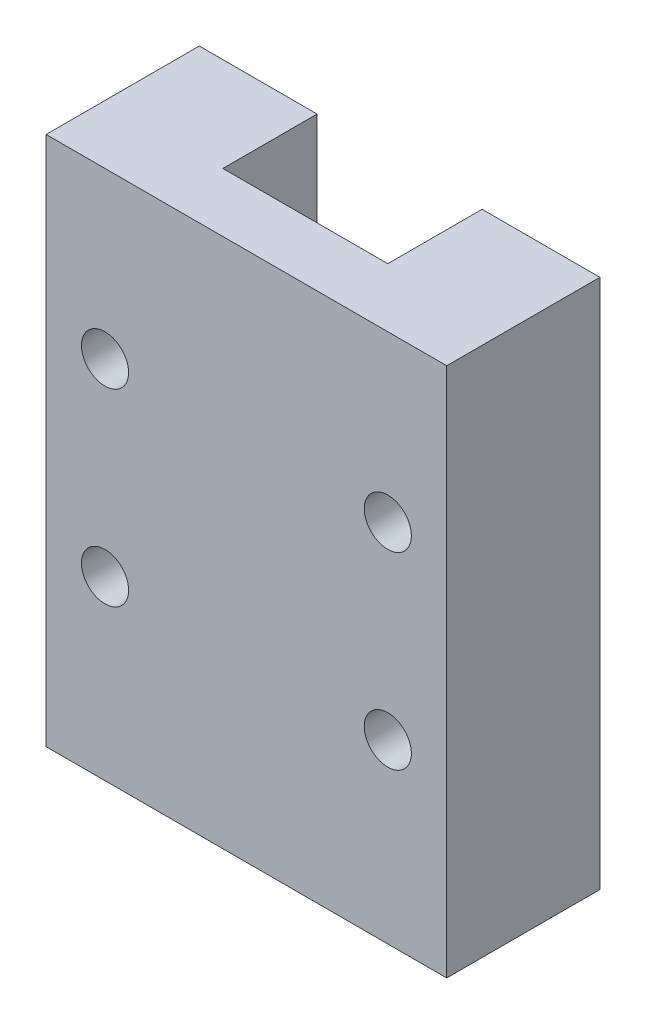
ISO-10303-21;
HEADER;
FILE_DESCRIPTION(('STEP AP214'),'2;1');
FILE_NAME('part.step','',(''),(''),'','','');
FILE_SCHEMA(('AUTOMOTIVE_DESIGN { 1 0 10303 214 1 1 1 1 }'));
ENDSEC;
DATA;
#1=APPLICATION_CONTEXT('core data for automotive mechanical design processes');
#2=APPLICATION_PROTOCOL_DEFINITION('international standard','automotive_design',2000,#1);
#3=PRODUCT_CONTEXT('',#1,'mechanical');
#4=PRODUCT('Part','Part','',(#3));
#5=PRODUCT_RELATED_PRODUCT_CATEGORY('part','',(#4));
#6=PRODUCT_DEFINITION_FORMATION('','',#4);
#7=PRODUCT_DEFINITION_CONTEXT('part definition',#1,'design');
#8=PRODUCT_DEFINITION('design','',#6,#7);
#9=PRODUCT_DEFINITION_SHAPE('','',#8);
#10=(LENGTH_UNIT() NAMED_UNIT(*) SI_UNIT(.MILLI.,.METRE.));
#11=(NAMED_UNIT(*) PLANE_ANGLE_UNIT() SI_UNIT($,.RADIAN.));
#12=(NAMED_UNIT(*) SI_UNIT($,.STERADIAN.) SOLID_ANGLE_UNIT());
#13=UNCERTAINTY_MEASURE_WITH_UNIT(LENGTH_MEASURE(1.E-05),#10,'distance_accuracy_value','');
#14=(GEOMETRIC_REPRESENTATION_CONTEXT(3) GLOBAL_UNCERTAINTY_ASSIGNED_CONTEXT((#13)) GLOBAL_UNIT_ASSIGNED_CONTEXT((#10,
#11,#12)) REPRESENTATION_CONTEXT('',''));
#15=CARTESIAN_POINT('',(0.,0.,0.));
#16=DIRECTION('',(0.,0.,1.));
#17=DIRECTION('',(1.,0.,0.));
#18=AXIS2_PLACEMENT_3D('',#15,#16,#17);
#19=CARTESIAN_POINT('',(8.5,22.5,-3.25));
#20=DIRECTION('',(-1.,0.,0.));
#21=DIRECTION('',(0.,0.,1.));
#22=AXIS2_PLACEMENT_3D('',#19,#20,#21);
#23=PLANE('',#22);
#24=DIRECTION('',(0.,0.,-1.));
#25=VECTOR('',#24,1.);
#26=CARTESIAN_POINT('',(8.5,0.,-3.25));
#27=LINE('',#26,#25);
#28=CARTESIAN_POINT('',(8.5,0.,3.25));
#29=VERTEX_POINT('',#28);
#30=CARTESIAN_POINT('',(8.5,0.,-3.25));
#31=VERTEX_POINT('',#30);
#32=EDGE_CURVE('E141',#29,#31,#27,.T.);
#33=ORIENTED_EDGE('',*,*,#32,.T.);
#34=DIRECTION('',(0.,-1.,0.));
#35=VECTOR('',#34,1.);
#36=CARTESIAN_POINT('',(8.5,22.5,-3.25));
#37=LINE('',#36,#35);
#38=CARTESIAN_POINT('',(8.5,22.5,-3.25));
#39=VERTEX_POINT('',#38);
#40=EDGE_CURVE('E11',#39,#31,#37,.T.);
#41=ORIENTED_EDGE('',*,*,#40,.F.);
#42=DIRECTION('',(0.,0.,-1.));
#43=VECTOR('',#42,1.);
#44=CARTESIAN_POINT('',(8.5,22.5,-3.25));
#45=LINE('',#44,#43);
#46=CARTESIAN_POINT('',(8.5,22.5,3.25));
#47=VERTEX_POINT('',#46);
#48=EDGE_CURVE('E156',#47,#39,#45,.T.);
#49=ORIENTED_EDGE('',*,*,#48,.F.);
#50=DIRECTION('',(0.,-1.,0.));
#51=VECTOR('',#50,1.);
#52=CARTESIAN_POINT('',(8.5,22.5,3.25));
#53=LINE('',#52,#51);
#54=EDGE_CURVE('E137',#47,#29,#53,.T.);
#55=ORIENTED_EDGE('',*,*,#54,.T.);
#56=EDGE_LOOP('',(#33,#41,#49,#55));
#57=FACE_BOUND('',#56,.T.);
#58=ADVANCED_FACE('F45',(#57),#23,.F.);
#59=CARTESIAN_POINT('',(3.5,22.5,-3.25));
#60=DIRECTION('',(0.,0.,1.));
#61=DIRECTION('',(1.,0.,0.));
#62=AXIS2_PLACEMENT_3D('',#59,#60,#61);
#63=PLANE('',#62);
#64=DIRECTION('',(-1.,0.,0.));
#65=VECTOR('',#64,1.);
#66=CARTESIAN_POINT('',(3.5,0.,-3.25));
#67=LINE('',#66,#65);
#68=CARTESIAN_POINT('',(3.5,0.,-3.25));
#69=VERTEX_POINT('',#68);
#70=EDGE_CURVE('E144',#31,#69,#67,.T.);
#71=ORIENTED_EDGE('',*,*,#70,.T.);
#72=DIRECTION('',(0.,-1.,0.));
#73=VECTOR('',#72,1.);
#74=CARTESIAN_POINT('',(3.5,22.5,-3.25));
#75=LINE('',#74,#73);
#76=CARTESIAN_POINT('',(3.5,22.5,-3.25));
#77=VERTEX_POINT('',#76);
#78=EDGE_CURVE('E53',#77,#69,#75,.T.);
#79=ORIENTED_EDGE('',*,*,#78,.F.);
#80=DIRECTION('',(-1.,0.,0.));
#81=VECTOR('',#80,1.);
#82=CARTESIAN_POINT('',(3.5,22.5,-3.25));
#83=LINE('',#82,#81);
#84=EDGE_CURVE('E104',#39,#77,#83,.T.);
#85=ORIENTED_EDGE('',*,*,#84,.F.);
#86=ORIENTED_EDGE('',*,*,#40,.T.);
#87=EDGE_LOOP('',(#71,#79,#85,#86));
#88=FACE_BOUND('',#87,.T.);
#89=ADVANCED_FACE('F237',(#88),#63,.F.);
#90=CARTESIAN_POINT('',(3.5,22.5,0.749999999999999));
#91=DIRECTION('',(1.,0.,0.));
#92=DIRECTION('',(0.,0.,-1.));
#93=AXIS2_PLACEMENT_3D('',#90,#91,#92);
#94=PLANE('',#93);
#95=DIRECTION('',(0.,0.,1.));
#96=VECTOR('',#95,1.);
#97=CARTESIAN_POINT('',(3.5,0.,0.749999999999999));
#98=LINE('',#97,#96);
#99=CARTESIAN_POINT('',(3.5,0.,0.749999999999999));
#100=VERTEX_POINT('',#99);
#101=EDGE_CURVE('E147',#69,#100,#98,.T.);
#102=ORIENTED_EDGE('',*,*,#101,.T.);
#103=DIRECTION('',(0.,-1.,0.));
#104=VECTOR('',#103,1.);
#105=CARTESIAN_POINT('',(3.5,22.5,0.749999999999999));
#106=LINE('',#105,#104);
#107=CARTESIAN_POINT('',(3.5,22.5,0.749999999999999));
#108=VERTEX_POINT('',#107);
#109=EDGE_CURVE('E163',#108,#100,#106,.T.);
#110=ORIENTED_EDGE('',*,*,#109,.F.);
#111=DIRECTION('',(0.,0.,1.));
#112=VECTOR('',#111,1.);
#113=CARTESIAN_POINT('',(3.5,22.5,0.749999999999999));
#114=LINE('',#113,#112);
#115=EDGE_CURVE('E171',#77,#108,#114,.T.);
#116=ORIENTED_EDGE('',*,*,#115,.F.);
#117=ORIENTED_EDGE('',*,*,#78,.T.);
#118=EDGE_LOOP('',(#102,#110,#116,#117));
#119=FACE_BOUND('',#118,.T.);
#120=ADVANCED_FACE('F169',(#119),#94,.F.);
#121=CARTESIAN_POINT('',(-3.5,22.5,0.749999999999999));
#122=DIRECTION('',(0.,0.,1.));
#123=DIRECTION('',(1.,0.,0.));
#124=AXIS2_PLACEMENT_3D('',#121,#122,#123);
#125=PLANE('',#124);
#126=DIRECTION('',(-1.,0.,0.));
#127=VECTOR('',#126,1.);
#128=CARTESIAN_POINT('',(-3.5,0.,0.749999999999999));
#129=LINE('',#128,#127);
#130=CARTESIAN_POINT('',(-3.5,0.,0.749999999999999));
#131=VERTEX_POINT('',#130);
#132=EDGE_CURVE('E149',#100,#131,#129,.T.);
#133=ORIENTED_EDGE('',*,*,#132,.T.);
#134=DIRECTION('',(0.,-1.,0.));
#135=VECTOR('',#134,1.);
#136=CARTESIAN_POINT('',(-3.5,22.5,0.749999999999999));
#137=LINE('',#136,#135);
#138=CARTESIAN_POINT('',(-3.5,22.5,0.749999999999999));
#139=VERTEX_POINT('',#138);
#140=EDGE_CURVE('E160',#139,#131,#137,.T.);
#141=ORIENTED_EDGE('',*,*,#140,.F.);
#142=DIRECTION('',(-1.,0.,0.));
#143=VECTOR('',#142,1.);
#144=CARTESIAN_POINT('',(-3.5,22.5,0.749999999999999));
#145=LINE('',#144,#143);
#146=EDGE_CURVE('E183',#108,#139,#145,.T.);
#147=ORIENTED_EDGE('',*,*,#146,.F.);
#148=ORIENTED_EDGE('',*,*,#109,.T.);
#149=EDGE_LOOP('',(#133,#141,#147,#148));
#150=FACE_BOUND('',#149,.T.);
#151=ADVANCED_FACE('F179',(#150),#125,.F.);
#152=CARTESIAN_POINT('',(-3.5,22.5,0.749999999999999));
#153=DIRECTION('',(-1.,0.,0.));
#154=DIRECTION('',(0.,0.,1.));
#155=AXIS2_PLACEMENT_3D('',#152,#153,#154);
#156=PLANE('',#155);
#157=DIRECTION('',(0.,0.,-1.));
#158=VECTOR('',#157,1.);
#159=CARTESIAN_POINT('',(-3.5,0.,0.749999999999999));
#160=LINE('',#159,#158);
#161=CARTESIAN_POINT('',(-3.5,0.,-3.25));
#162=VERTEX_POINT('',#161);
#163=EDGE_CURVE('E151',#131,#162,#160,.T.);
#164=ORIENTED_EDGE('',*,*,#163,.T.);
#165=DIRECTION('',(0.,-1.,0.));
#166=VECTOR('',#165,1.);
#167=CARTESIAN_POINT('',(-3.5,22.5,-3.25));
#168=LINE('',#167,#166);
#169=CARTESIAN_POINT('',(-3.5,22.5,-3.25));
#170=VERTEX_POINT('',#169);
#171=EDGE_CURVE('E132',#170,#162,#168,.T.);
#172=ORIENTED_EDGE('',*,*,#171,.F.);
#173=DIRECTION('',(0.,0.,-1.));
#174=VECTOR('',#173,1.);
#175=CARTESIAN_POINT('',(-3.5,22.5,0.749999999999999));
#176=LINE('',#175,#174);
#177=EDGE_CURVE('E123',#139,#170,#176,.T.);
#178=ORIENTED_EDGE('',*,*,#177,.F.);
#179=ORIENTED_EDGE('',*,*,#140,.T.);
#180=EDGE_LOOP('',(#164,#172,#178,#179));
#181=FACE_BOUND('',#180,.T.);
#182=ADVANCED_FACE('F182',(#181),#156,.F.);
#183=CARTESIAN_POINT('',(-8.5,22.5,-3.25));
#184=DIRECTION('',(0.,0.,1.));
#185=DIRECTION('',(1.,0.,0.));
#186=AXIS2_PLACEMENT_3D('',#183,#184,#185);
#187=PLANE('',#186);
#188=DIRECTION('',(-1.,0.,0.));
#189=VECTOR('',#188,1.);
#190=CARTESIAN_POINT('',(-8.5,0.,-3.25));
#191=LINE('',#190,#189);
#192=CARTESIAN_POINT('',(-8.5,0.,-3.25));
#193=VERTEX_POINT('',#192);
#194=EDGE_CURVE('E131',#162,#193,#191,.T.);
#195=ORIENTED_EDGE('',*,*,#194,.T.);
#196=DIRECTION('',(0.,-1.,0.));
#197=VECTOR('',#196,1.);
#198=CARTESIAN_POINT('',(-8.5,22.5,-3.25));
#199=LINE('',#198,#197);
#200=CARTESIAN_POINT('',(-8.5,22.5,-3.25));
#201=VERTEX_POINT('',#200);
#202=EDGE_CURVE('E128',#201,#193,#199,.T.);
#203=ORIENTED_EDGE('',*,*,#202,.F.);
#204=DIRECTION('',(-1.,0.,0.));
#205=VECTOR('',#204,1.);
#206=CARTESIAN_POINT('',(-8.5,22.5,-3.25));
#207=LINE('',#206,#205);
#208=EDGE_CURVE('E117',#170,#201,#207,.T.);
#209=ORIENTED_EDGE('',*,*,#208,.F.);
#210=ORIENTED_EDGE('',*,*,#171,.T.);
#211=EDGE_LOOP('',(#195,#203,#209,#210));
#212=FACE_BOUND('',#211,.T.);
#213=ADVANCED_FACE('F129',(#212),#187,.F.);
#214=CARTESIAN_POINT('',(-8.5,22.5,-3.25));
#215=DIRECTION('',(1.,0.,0.));
#216=DIRECTION('',(0.,0.,-1.));
#217=AXIS2_PLACEMENT_3D('',#214,#215,#216);
#218=PLANE('',#217);
#219=DIRECTION('',(0.,0.,1.));
#220=VECTOR('',#219,1.);
#221=CARTESIAN_POINT('',(-8.5,0.,-3.25));
#222=LINE('',#221,#220);
#223=CARTESIAN_POINT('',(-8.5,0.,3.25));
#224=VERTEX_POINT('',#223);
#225=EDGE_CURVE('E90',#193,#224,#222,.T.);
#226=ORIENTED_EDGE('',*,*,#225,.T.);
#227=DIRECTION('',(0.,-1.,0.));
#228=VECTOR('',#227,1.);
#229=CARTESIAN_POINT('',(-8.5,22.5,3.25));
#230=LINE('',#229,#228);
#231=CARTESIAN_POINT('',(-8.5,22.5,3.25));
#232=VERTEX_POINT('',#231);
#233=EDGE_CURVE('E133',#232,#224,#230,.T.);
#234=ORIENTED_EDGE('',*,*,#233,.F.);
#235=DIRECTION('',(0.,0.,1.));
#236=VECTOR('',#235,1.);
#237=CARTESIAN_POINT('',(-8.5,22.5,-3.25));
#238=LINE('',#237,#236);
#239=EDGE_CURVE('E121',#201,#232,#238,.T.);
#240=ORIENTED_EDGE('',*,*,#239,.F.);
#241=ORIENTED_EDGE('',*,*,#202,.T.);
#242=EDGE_LOOP('',(#226,#234,#240,#241));
#243=FACE_BOUND('',#242,.T.);
#244=ADVANCED_FACE('F135',(#243),#218,.F.);
#245=CARTESIAN_POINT('',(-8.5,22.5,3.25));
#246=DIRECTION('',(0.,0.,-1.));
#247=DIRECTION('',(-1.,0.,0.));
#248=AXIS2_PLACEMENT_3D('',#245,#246,#247);
#249=PLANE('',#248);
#250=CARTESIAN_POINT('',(6.,15.5,3.25));
#251=DIRECTION('',(0.,0.,1.));
#252=DIRECTION('',(-1.,0.,0.));
#253=AXIS2_PLACEMENT_3D('',#250,#251,#252);
#254=CIRCLE('',#253,0.999999999999998);
#255=CARTESIAN_POINT('',(5.,15.5,3.25));
#256=VERTEX_POINT('',#255);
#257=EDGE_CURVE('E198',#256,#256,#254,.T.);
#258=ORIENTED_EDGE('',*,*,#257,.F.);
#259=EDGE_LOOP('',(#258));
#260=FACE_BOUND('',#259,.T.);
#261=CARTESIAN_POINT('',(6.,7.5,3.25));
#262=DIRECTION('',(0.,0.,1.));
#263=DIRECTION('',(-1.,0.,0.));
#264=AXIS2_PLACEMENT_3D('',#261,#262,#263);
#265=CIRCLE('',#264,1.);
#266=CARTESIAN_POINT('',(5.,7.5,3.25));
#267=VERTEX_POINT('',#266);
#268=EDGE_CURVE('E204',#267,#267,#265,.T.);
#269=ORIENTED_EDGE('',*,*,#268,.F.);
#270=EDGE_LOOP('',(#269));
#271=FACE_BOUND('',#270,.T.);
#272=CARTESIAN_POINT('',(-6.,7.5,3.25));
#273=DIRECTION('',(0.,0.,1.));
#274=DIRECTION('',(1.,0.,0.));
#275=AXIS2_PLACEMENT_3D('',#272,#273,#274);
#276=CIRCLE('',#275,1.);
#277=CARTESIAN_POINT('',(-5.,7.5,3.25));
#278=VERTEX_POINT('',#277);
#279=EDGE_CURVE('E192',#278,#278,#276,.T.);
#280=ORIENTED_EDGE('',*,*,#279,.F.);
#281=EDGE_LOOP('',(#280));
#282=FACE_BOUND('',#281,.T.);
#283=CARTESIAN_POINT('',(-6.,15.5,3.25));
#284=DIRECTION('',(0.,0.,1.));
#285=DIRECTION('',(1.,0.,0.));
#286=AXIS2_PLACEMENT_3D('',#283,#284,#285);
#287=CIRCLE('',#286,1.);
#288=CARTESIAN_POINT('',(-5.,15.5,3.25));
#289=VERTEX_POINT('',#288);
#290=EDGE_CURVE('E189',#289,#289,#287,.T.);
#291=ORIENTED_EDGE('',*,*,#290,.F.);
#292=EDGE_LOOP('',(#291));
#293=FACE_BOUND('',#292,.T.);
#294=DIRECTION('',(1.,0.,0.));
#295=VECTOR('',#294,1.);
#296=CARTESIAN_POINT('',(-8.5,0.,3.25));
#297=LINE('',#296,#295);
#298=EDGE_CURVE('E96',#224,#29,#297,.T.);
#299=ORIENTED_EDGE('',*,*,#298,.T.);
#300=ORIENTED_EDGE('',*,*,#54,.F.);
#301=DIRECTION('',(1.,0.,0.));
#302=VECTOR('',#301,1.);
#303=CARTESIAN_POINT('',(-8.5,22.5,3.25));
#304=LINE('',#303,#302);
#305=EDGE_CURVE('E61',#232,#47,#304,.T.);
#306=ORIENTED_EDGE('',*,*,#305,.F.);
#307=ORIENTED_EDGE('',*,*,#233,.T.);
#308=EDGE_LOOP('',(#299,#300,#306,#307));
#309=FACE_BOUND('',#308,.T.);
#310=ADVANCED_FACE('F215',(#260,#271,#282,#293,#309),#249,.F.);
#311=CARTESIAN_POINT('',(0.,22.5,0.));
#312=DIRECTION('',(0.,1.,0.));
#313=DIRECTION('',(0.,0.,1.));
#314=AXIS2_PLACEMENT_3D('',#311,#312,#313);
#315=PLANE('',#314);
#316=ORIENTED_EDGE('',*,*,#48,.T.);
#317=ORIENTED_EDGE('',*,*,#84,.T.);
#318=ORIENTED_EDGE('',*,*,#115,.T.);
#319=ORIENTED_EDGE('',*,*,#146,.T.);
#320=ORIENTED_EDGE('',*,*,#177,.T.);
#321=ORIENTED_EDGE('',*,*,#208,.T.);
#322=ORIENTED_EDGE('',*,*,#239,.T.);
#323=ORIENTED_EDGE('',*,*,#305,.T.);
#324=EDGE_LOOP('',(#316,#317,#318,#319,#320,#321,#322,#323));
#325=FACE_BOUND('',#324,.T.);
#326=ADVANCED_FACE('F119',(#325),#315,.T.);
#327=CARTESIAN_POINT('',(0.,0.,0.));
#328=DIRECTION('',(0.,1.,0.));
#329=DIRECTION('',(0.,0.,1.));
#330=AXIS2_PLACEMENT_3D('',#327,#328,#329);
#331=PLANE('',#330);
#332=ORIENTED_EDGE('',*,*,#32,.F.);
#333=ORIENTED_EDGE('',*,*,#298,.F.);
#334=ORIENTED_EDGE('',*,*,#225,.F.);
#335=ORIENTED_EDGE('',*,*,#194,.F.);
#336=ORIENTED_EDGE('',*,*,#163,.F.);
#337=ORIENTED_EDGE('',*,*,#132,.F.);
#338=ORIENTED_EDGE('',*,*,#101,.F.);
#339=ORIENTED_EDGE('',*,*,#70,.F.);
#340=EDGE_LOOP('',(#332,#333,#334,#335,#336,#337,#338,#339));
#341=FACE_BOUND('',#340,.T.);
#342=ADVANCED_FACE('F175',(#341),#331,.F.);
#343=CARTESIAN_POINT('',(-6.,15.5,-0.750000000000001));
#344=DIRECTION('',(0.,0.,1.));
#345=DIRECTION('',(1.,0.,0.));
#346=AXIS2_PLACEMENT_3D('',#343,#344,#345);
#347=CYLINDRICAL_SURFACE('',#346,1.);
#348=CARTESIAN_POINT('',(-6.,15.5,-0.750000000000001));
#349=DIRECTION('',(0.,0.,1.));
#350=DIRECTION('',(1.,0.,0.));
#351=AXIS2_PLACEMENT_3D('',#348,#349,#350);
#352=CIRCLE('',#351,1.);
#353=CARTESIAN_POINT('',(-5.,15.5,-0.750000000000001));
#354=VERTEX_POINT('',#353);
#355=EDGE_CURVE('E145',#354,#354,#352,.T.);
#356=ORIENTED_EDGE('',*,*,#355,.F.);
#357=EDGE_LOOP('',(#356));
#358=FACE_BOUND('',#357,.T.);
#359=ORIENTED_EDGE('',*,*,#290,.T.);
#360=EDGE_LOOP('',(#359));
#361=FACE_BOUND('',#360,.T.);
#362=ADVANCED_FACE('F222',(#358,#361),#347,.F.);
#363=CARTESIAN_POINT('',(-6.,15.5,-0.750000000000001));
#364=DIRECTION('',(0.,0.,1.));
#365=DIRECTION('',(1.,0.,0.));
#366=AXIS2_PLACEMENT_3D('',#363,#364,#365);
#367=PLANE('',#366);
#368=ORIENTED_EDGE('',*,*,#355,.T.);
#369=EDGE_LOOP('',(#368));
#370=FACE_BOUND('',#369,.T.);
#371=ADVANCED_FACE('F224',(#370),#367,.T.);
#372=CARTESIAN_POINT('',(-6.,7.5,-0.750000000000001));
#373=DIRECTION('',(0.,0.,1.));
#374=DIRECTION('',(1.,0.,0.));
#375=AXIS2_PLACEMENT_3D('',#372,#373,#374);
#376=CYLINDRICAL_SURFACE('',#375,1.);
#377=CARTESIAN_POINT('',(-6.,7.5,-0.750000000000001));
#378=DIRECTION('',(0.,0.,1.));
#379=DIRECTION('',(1.,0.,0.));
#380=AXIS2_PLACEMENT_3D('',#377,#378,#379);
#381=CIRCLE('',#380,1.);
#382=CARTESIAN_POINT('',(-5.,7.5,-0.750000000000001));
#383=VERTEX_POINT('',#382);
#384=EDGE_CURVE('E207',#383,#383,#381,.T.);
#385=ORIENTED_EDGE('',*,*,#384,.F.);
#386=EDGE_LOOP('',(#385));
#387=FACE_BOUND('',#386,.T.);
#388=ORIENTED_EDGE('',*,*,#279,.T.);
#389=EDGE_LOOP('',(#388));
#390=FACE_BOUND('',#389,.T.);
#391=ADVANCED_FACE('F213',(#387,#390),#376,.F.);
#392=CARTESIAN_POINT('',(-6.,7.5,-0.750000000000001));
#393=DIRECTION('',(0.,0.,1.));
#394=DIRECTION('',(1.,0.,0.));
#395=AXIS2_PLACEMENT_3D('',#392,#393,#394);
#396=PLANE('',#395);
#397=ORIENTED_EDGE('',*,*,#384,.T.);
#398=EDGE_LOOP('',(#397));
#399=FACE_BOUND('',#398,.T.);
#400=ADVANCED_FACE('F294',(#399),#396,.T.);
#401=CARTESIAN_POINT('',(6.,7.5,-0.750000000000001));
#402=DIRECTION('',(0.,0.,1.));
#403=DIRECTION('',(1.,0.,0.));
#404=AXIS2_PLACEMENT_3D('',#401,#402,#403);
#405=CYLINDRICAL_SURFACE('',#404,1.);
#406=CARTESIAN_POINT('',(6.,7.5,-0.750000000000001));
#407=DIRECTION('',(0.,0.,1.));
#408=DIRECTION('',(-1.,0.,0.));
#409=AXIS2_PLACEMENT_3D('',#406,#407,#408);
#410=CIRCLE('',#409,1.);
#411=CARTESIAN_POINT('',(5.,7.5,-0.750000000000001));
#412=VERTEX_POINT('',#411);
#413=EDGE_CURVE('E201',#412,#412,#410,.T.);
#414=ORIENTED_EDGE('',*,*,#413,.F.);
#415=EDGE_LOOP('',(#414));
#416=FACE_BOUND('',#415,.T.);
#417=ORIENTED_EDGE('',*,*,#268,.T.);
#418=EDGE_LOOP('',(#417));
#419=FACE_BOUND('',#418,.T.);
#420=ADVANCED_FACE('F305',(#416,#419),#405,.F.);
#421=CARTESIAN_POINT('',(6.,7.5,-0.750000000000001));
#422=DIRECTION('',(0.,0.,-1.));
#423=DIRECTION('',(-1.,0.,0.));
#424=AXIS2_PLACEMENT_3D('',#421,#422,#423);
#425=PLANE('',#424);
#426=ORIENTED_EDGE('',*,*,#413,.T.);
#427=EDGE_LOOP('',(#426));
#428=FACE_BOUND('',#427,.T.);
#429=ADVANCED_FACE('F316',(#428),#425,.F.);
#430=CARTESIAN_POINT('',(6.,15.5,-0.750000000000001));
#431=DIRECTION('',(0.,0.,1.));
#432=DIRECTION('',(1.,0.,0.));
#433=AXIS2_PLACEMENT_3D('',#430,#431,#432);
#434=CYLINDRICAL_SURFACE('',#433,0.999999999999998);
#435=CARTESIAN_POINT('',(6.,15.5,-0.750000000000001));
#436=DIRECTION('',(0.,0.,1.));
#437=DIRECTION('',(-1.,0.,0.));
#438=AXIS2_PLACEMENT_3D('',#435,#436,#437);
#439=CIRCLE('',#438,0.999999999999998);
#440=CARTESIAN_POINT('',(5.,15.5,-0.750000000000001));
#441=VERTEX_POINT('',#440);
#442=EDGE_CURVE('E195',#441,#441,#439,.T.);
#443=ORIENTED_EDGE('',*,*,#442,.F.);
#444=EDGE_LOOP('',(#443));
#445=FACE_BOUND('',#444,.T.);
#446=ORIENTED_EDGE('',*,*,#257,.T.);
#447=EDGE_LOOP('',(#446));
#448=FACE_BOUND('',#447,.T.);
#449=ADVANCED_FACE('F327',(#445,#448),#434,.F.);
#450=CARTESIAN_POINT('',(6.,15.5,-0.750000000000001));
#451=DIRECTION('',(0.,0.,-1.));
#452=DIRECTION('',(-1.,0.,0.));
#453=AXIS2_PLACEMENT_3D('',#450,#451,#452);
#454=PLANE('',#453);
#455=ORIENTED_EDGE('',*,*,#442,.T.);
#456=EDGE_LOOP('',(#455));
#457=FACE_BOUND('',#456,.T.);
#458=ADVANCED_FACE('F338',(#457),#454,.F.);
#459=CLOSED_SHELL('',(#58,#89,#120,#151,#182,#213,#244,#310,#326,#342,#362,#371,#391,#400,#420,
#429,#449,#458));
#460=MANIFOLD_SOLID_BREP('B2',#459);
#461=ADVANCED_BREP_SHAPE_REPRESENTATION('',(#18,#460),#14);
#462=SHAPE_DEFINITION_REPRESENTATION(#9,#461);
ENDSEC;
END-ISO-10303-21;
